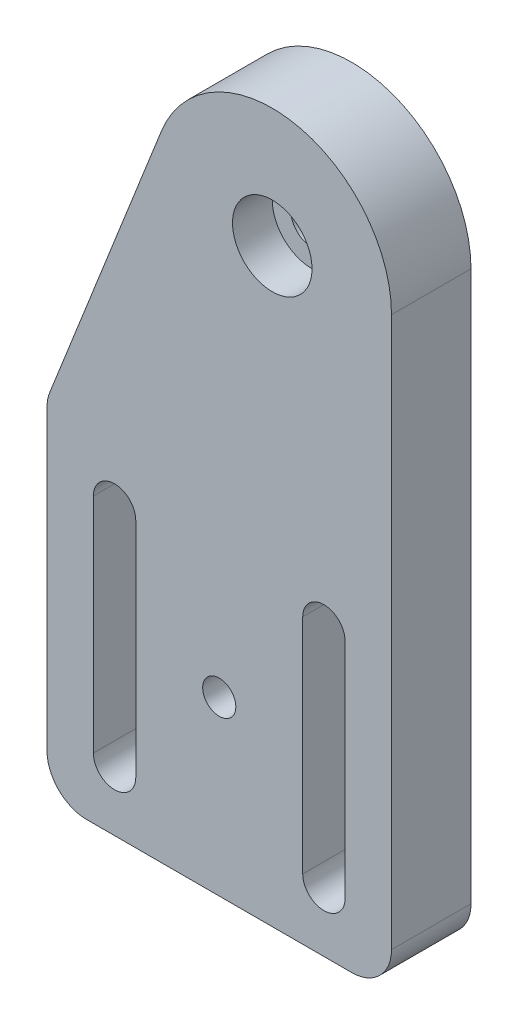
ISO-10303-21;
HEADER;
FILE_DESCRIPTION(('STEP AP214'),'2;1');
FILE_NAME('part.step','',(''),(''),'','','');
FILE_SCHEMA(('AUTOMOTIVE_DESIGN { 1 0 10303 214 1 1 1 1 }'));
ENDSEC;
DATA;
#1=APPLICATION_CONTEXT('core data for automotive mechanical design processes');
#2=APPLICATION_PROTOCOL_DEFINITION('international standard','automotive_design',2000,#1);
#3=PRODUCT_CONTEXT('',#1,'mechanical');
#4=PRODUCT('Part','Part','',(#3));
#5=PRODUCT_RELATED_PRODUCT_CATEGORY('part','',(#4));
#6=PRODUCT_DEFINITION_FORMATION('','',#4);
#7=PRODUCT_DEFINITION_CONTEXT('part definition',#1,'design');
#8=PRODUCT_DEFINITION('design','',#6,#7);
#9=PRODUCT_DEFINITION_SHAPE('','',#8);
#10=(LENGTH_UNIT() NAMED_UNIT(*) SI_UNIT(.MILLI.,.METRE.));
#11=(NAMED_UNIT(*) PLANE_ANGLE_UNIT() SI_UNIT($,.RADIAN.));
#12=(NAMED_UNIT(*) SI_UNIT($,.STERADIAN.) SOLID_ANGLE_UNIT());
#13=UNCERTAINTY_MEASURE_WITH_UNIT(LENGTH_MEASURE(1.E-05),#10,'distance_accuracy_value','');
#14=(GEOMETRIC_REPRESENTATION_CONTEXT(3) GLOBAL_UNCERTAINTY_ASSIGNED_CONTEXT((#13)) GLOBAL_UNIT_ASSIGNED_CONTEXT((#10,
#11,#12)) REPRESENTATION_CONTEXT('',''));
#15=CARTESIAN_POINT('',(0.,0.,0.));
#16=DIRECTION('',(0.,0.,1.));
#17=DIRECTION('',(1.,0.,0.));
#18=AXIS2_PLACEMENT_3D('',#15,#16,#17);
#19=CARTESIAN_POINT('',(4.,0.,-6.));
#20=DIRECTION('',(0.,0.,1.));
#21=DIRECTION('',(-1.,0.,0.));
#22=AXIS2_PLACEMENT_3D('',#19,#20,#21);
#23=PLANE('',#22);
#24=CARTESIAN_POINT('',(4.,0.,-6.));
#25=DIRECTION('',(0.,0.,1.));
#26=DIRECTION('',(1.,0.,0.));
#27=AXIS2_PLACEMENT_3D('',#24,#25,#26);
#28=CIRCLE('',#27,1.6);
#29=CARTESIAN_POINT('',(5.6,0.,-6.));
#30=VERTEX_POINT('',#29);
#31=EDGE_CURVE('E410',#30,#30,#28,.T.);
#32=ORIENTED_EDGE('',*,*,#31,.T.);
#33=EDGE_LOOP('',(#32));
#34=FACE_BOUND('',#33,.T.);
#35=CARTESIAN_POINT('',(0.,-31.5,-6.));
#36=DIRECTION('',(0.,0.,1.));
#37=DIRECTION('',(1.,0.,0.));
#38=AXIS2_PLACEMENT_3D('',#35,#36,#37);
#39=CIRCLE('',#38,1.25);
#40=CARTESIAN_POINT('',(1.25,-31.5,-6.));
#41=VERTEX_POINT('',#40);
#42=EDGE_CURVE('E405',#41,#41,#39,.T.);
#43=ORIENTED_EDGE('',*,*,#42,.T.);
#44=EDGE_LOOP('',(#43));
#45=FACE_BOUND('',#44,.T.);
#46=CARTESIAN_POINT('',(-7.9,-23.1,-6.));
#47=DIRECTION('',(0.,0.,1.));
#48=DIRECTION('',(1.,0.,0.));
#49=AXIS2_PLACEMENT_3D('',#46,#47,#48);
#50=CIRCLE('',#49,1.6);
#51=CARTESIAN_POINT('',(-6.3,-23.1,-6.));
#52=VERTEX_POINT('',#51);
#53=CARTESIAN_POINT('',(-9.5,-23.1,-6.));
#54=VERTEX_POINT('',#53);
#55=EDGE_CURVE('E195',#52,#54,#50,.T.);
#56=ORIENTED_EDGE('',*,*,#55,.T.);
#57=DIRECTION('',(0.,-1.,0.));
#58=VECTOR('',#57,1.);
#59=CARTESIAN_POINT('',(-9.5,-23.1,-6.));
#60=LINE('',#59,#58);
#61=CARTESIAN_POINT('',(-9.5,-39.9,-6.));
#62=VERTEX_POINT('',#61);
#63=EDGE_CURVE('E198',#54,#62,#60,.T.);
#64=ORIENTED_EDGE('',*,*,#63,.T.);
#65=CARTESIAN_POINT('',(-7.9,-39.9,-6.));
#66=DIRECTION('',(0.,0.,1.));
#67=DIRECTION('',(1.,0.,0.));
#68=AXIS2_PLACEMENT_3D('',#65,#66,#67);
#69=CIRCLE('',#68,1.6);
#70=CARTESIAN_POINT('',(-6.3,-39.9,-6.));
#71=VERTEX_POINT('',#70);
#72=EDGE_CURVE('E202',#62,#71,#69,.T.);
#73=ORIENTED_EDGE('',*,*,#72,.T.);
#74=DIRECTION('',(0.,-1.,0.));
#75=VECTOR('',#74,1.);
#76=CARTESIAN_POINT('',(-6.3,-23.1,-6.));
#77=LINE('',#76,#75);
#78=EDGE_CURVE('E205',#52,#71,#77,.T.);
#79=ORIENTED_EDGE('',*,*,#78,.F.);
#80=EDGE_LOOP('',(#56,#64,#73,#79));
#81=FACE_BOUND('',#80,.T.);
#82=DIRECTION('',(-1.,0.,0.));
#83=VECTOR('',#82,1.);
#84=CARTESIAN_POINT('',(13.,-44.5,-6.));
#85=LINE('',#84,#83);
#86=CARTESIAN_POINT('',(10.,-44.5,-6.));
#87=VERTEX_POINT('',#86);
#88=CARTESIAN_POINT('',(-9.99999999999999,-44.5,-6.));
#89=VERTEX_POINT('',#88);
#90=EDGE_CURVE('E230',#87,#89,#85,.T.);
#91=ORIENTED_EDGE('',*,*,#90,.T.);
#92=CARTESIAN_POINT('',(-10.,-41.5,-6.));
#93=DIRECTION('',(0.,0.,-1.));
#94=DIRECTION('',(-1.,0.,0.));
#95=AXIS2_PLACEMENT_3D('',#92,#93,#94);
#96=CIRCLE('',#95,3.);
#97=CARTESIAN_POINT('',(-13.,-41.5,-6.));
#98=VERTEX_POINT('',#97);
#99=EDGE_CURVE('E275',#98,#89,#96,.F.);
#100=ORIENTED_EDGE('',*,*,#99,.F.);
#101=DIRECTION('',(0.,1.,0.));
#102=VECTOR('',#101,1.);
#103=CARTESIAN_POINT('',(-13.,-44.5,-6.));
#104=LINE('',#103,#102);
#105=CARTESIAN_POINT('',(-13.,-19.0720086397861,-6.));
#106=VERTEX_POINT('',#105);
#107=EDGE_CURVE('E234',#98,#106,#104,.T.);
#108=ORIENTED_EDGE('',*,*,#107,.T.);
#109=CARTESIAN_POINT('',(-10.,-19.0720086397861,-6.));
#110=DIRECTION('',(0.,0.,-1.));
#111=DIRECTION('',(-1.,0.,0.));
#112=AXIS2_PLACEMENT_3D('',#109,#110,#111);
#113=CIRCLE('',#112,3.);
#114=CARTESIAN_POINT('',(-12.7895226229499,-17.9681229862646,-6.));
#115=VERTEX_POINT('',#114);
#116=EDGE_CURVE('E273',#115,#106,#113,.F.);
#117=ORIENTED_EDGE('',*,*,#116,.F.);
#118=DIRECTION('',(0.367961884507179,0.929840874316636,0.));
#119=VECTOR('',#118,1.);
#120=CARTESIAN_POINT('',(-13.,-18.5,-6.));
#121=LINE('',#120,#119);
#122=CARTESIAN_POINT('',(-4.36856786884972,3.31165696056461,-6.));
#123=VERTEX_POINT('',#122);
#124=EDGE_CURVE('E237',#115,#123,#121,.T.);
#125=ORIENTED_EDGE('',*,*,#124,.T.);
#126=CARTESIAN_POINT('',(4.,0.,-6.));
#127=DIRECTION('',(0.,0.,-1.));
#128=DIRECTION('',(-1.,0.,0.));
#129=AXIS2_PLACEMENT_3D('',#126,#127,#128);
#130=CIRCLE('',#129,9.);
#131=CARTESIAN_POINT('',(13.,0.,-6.));
#132=VERTEX_POINT('',#131);
#133=EDGE_CURVE('E240',#123,#132,#130,.T.);
#134=ORIENTED_EDGE('',*,*,#133,.T.);
#135=DIRECTION('',(0.,-1.,0.));
#136=VECTOR('',#135,1.);
#137=CARTESIAN_POINT('',(13.,-18.5,-6.));
#138=LINE('',#137,#136);
#139=CARTESIAN_POINT('',(13.,-41.5,-6.));
#140=VERTEX_POINT('',#139);
#141=EDGE_CURVE('E227',#132,#140,#138,.T.);
#142=ORIENTED_EDGE('',*,*,#141,.T.);
#143=CARTESIAN_POINT('',(10.,-41.5,-6.));
#144=DIRECTION('',(0.,0.,-1.));
#145=DIRECTION('',(-1.,0.,0.));
#146=AXIS2_PLACEMENT_3D('',#143,#144,#145);
#147=CIRCLE('',#146,3.);
#148=EDGE_CURVE('E277',#87,#140,#147,.F.);
#149=ORIENTED_EDGE('',*,*,#148,.F.);
#150=EDGE_LOOP('',(#91,#100,#108,#117,#125,#134,#142,#149));
#151=FACE_BOUND('',#150,.T.);
#152=CARTESIAN_POINT('',(7.9,-23.1,-6.));
#153=DIRECTION('',(0.,0.,1.));
#154=DIRECTION('',(1.,0.,0.));
#155=AXIS2_PLACEMENT_3D('',#152,#153,#154);
#156=CIRCLE('',#155,1.6);
#157=CARTESIAN_POINT('',(9.5,-23.1,-6.));
#158=VERTEX_POINT('',#157);
#159=CARTESIAN_POINT('',(6.3,-23.1,-6.));
#160=VERTEX_POINT('',#159);
#161=EDGE_CURVE('E153',#158,#160,#156,.T.);
#162=ORIENTED_EDGE('',*,*,#161,.T.);
#163=DIRECTION('',(0.,-1.,0.));
#164=VECTOR('',#163,1.);
#165=CARTESIAN_POINT('',(6.3,-23.1,-6.));
#166=LINE('',#165,#164);
#167=CARTESIAN_POINT('',(6.3,-39.9,-6.));
#168=VERTEX_POINT('',#167);
#169=EDGE_CURVE('E163',#160,#168,#166,.T.);
#170=ORIENTED_EDGE('',*,*,#169,.T.);
#171=CARTESIAN_POINT('',(7.9,-39.9,-6.));
#172=DIRECTION('',(0.,0.,1.));
#173=DIRECTION('',(1.,0.,0.));
#174=AXIS2_PLACEMENT_3D('',#171,#172,#173);
#175=CIRCLE('',#174,1.6);
#176=CARTESIAN_POINT('',(9.5,-39.9,-6.));
#177=VERTEX_POINT('',#176);
#178=EDGE_CURVE('E168',#168,#177,#175,.T.);
#179=ORIENTED_EDGE('',*,*,#178,.T.);
#180=DIRECTION('',(0.,-1.,0.));
#181=VECTOR('',#180,1.);
#182=CARTESIAN_POINT('',(9.5,-23.1,-6.));
#183=LINE('',#182,#181);
#184=EDGE_CURVE('E172',#158,#177,#183,.T.);
#185=ORIENTED_EDGE('',*,*,#184,.F.);
#186=EDGE_LOOP('',(#162,#170,#179,#185));
#187=FACE_BOUND('',#186,.T.);
#188=ADVANCED_FACE('F37',(#34,#45,#81,#151,#187),#23,.F.);
#189=CARTESIAN_POINT('',(4.,0.,0.));
#190=DIRECTION('',(0.,0.,1.));
#191=DIRECTION('',(-1.,0.,0.));
#192=AXIS2_PLACEMENT_3D('',#189,#190,#191);
#193=PLANE('',#192);
#194=CARTESIAN_POINT('',(0.,-31.5,0.));
#195=DIRECTION('',(0.,0.,1.));
#196=DIRECTION('',(1.,0.,0.));
#197=AXIS2_PLACEMENT_3D('',#194,#195,#196);
#198=CIRCLE('',#197,1.25);
#199=CARTESIAN_POINT('',(1.25,-31.5,0.));
#200=VERTEX_POINT('',#199);
#201=EDGE_CURVE('E402',#200,#200,#198,.T.);
#202=ORIENTED_EDGE('',*,*,#201,.F.);
#203=EDGE_LOOP('',(#202));
#204=FACE_BOUND('',#203,.T.);
#205=CARTESIAN_POINT('',(4.,0.,0.));
#206=DIRECTION('',(0.,0.,1.));
#207=DIRECTION('',(1.,0.,0.));
#208=AXIS2_PLACEMENT_3D('',#205,#206,#207);
#209=CIRCLE('',#208,3.);
#210=CARTESIAN_POINT('',(7.,0.,0.));
#211=VERTEX_POINT('',#210);
#212=EDGE_CURVE('E179',#211,#211,#209,.T.);
#213=ORIENTED_EDGE('',*,*,#212,.F.);
#214=EDGE_LOOP('',(#213));
#215=FACE_BOUND('',#214,.T.);
#216=DIRECTION('',(0.,1.,0.));
#217=VECTOR('',#216,1.);
#218=CARTESIAN_POINT('',(13.,-18.5,0.));
#219=LINE('',#218,#217);
#220=CARTESIAN_POINT('',(13.,-41.5,0.));
#221=VERTEX_POINT('',#220);
#222=CARTESIAN_POINT('',(13.,0.,0.));
#223=VERTEX_POINT('',#222);
#224=EDGE_CURVE('E231',#221,#223,#219,.T.);
#225=ORIENTED_EDGE('',*,*,#224,.T.);
#226=CARTESIAN_POINT('',(4.,0.,0.));
#227=DIRECTION('',(0.,0.,-1.));
#228=DIRECTION('',(-1.,0.,0.));
#229=AXIS2_PLACEMENT_3D('',#226,#227,#228);
#230=CIRCLE('',#229,9.);
#231=CARTESIAN_POINT('',(-4.36856786884972,3.31165696056461,0.));
#232=VERTEX_POINT('',#231);
#233=EDGE_CURVE('E251',#232,#223,#230,.T.);
#234=ORIENTED_EDGE('',*,*,#233,.F.);
#235=DIRECTION('',(0.367961884507179,0.929840874316636,0.));
#236=VECTOR('',#235,1.);
#237=CARTESIAN_POINT('',(-13.,-18.5,0.));
#238=LINE('',#237,#236);
#239=CARTESIAN_POINT('',(-12.7895226229499,-17.9681229862646,0.));
#240=VERTEX_POINT('',#239);
#241=EDGE_CURVE('E248',#240,#232,#238,.T.);
#242=ORIENTED_EDGE('',*,*,#241,.F.);
#243=CARTESIAN_POINT('',(-10.,-19.0720086397861,0.));
#244=DIRECTION('',(0.,0.,-1.));
#245=DIRECTION('',(-1.,0.,0.));
#246=AXIS2_PLACEMENT_3D('',#243,#244,#245);
#247=CIRCLE('',#246,3.);
#248=CARTESIAN_POINT('',(-13.,-19.0720086397861,0.));
#249=VERTEX_POINT('',#248);
#250=EDGE_CURVE('E261',#249,#240,#247,.T.);
#251=ORIENTED_EDGE('',*,*,#250,.F.);
#252=DIRECTION('',(0.,1.,0.));
#253=VECTOR('',#252,1.);
#254=CARTESIAN_POINT('',(-13.,-44.5,0.));
#255=LINE('',#254,#253);
#256=CARTESIAN_POINT('',(-13.,-41.5,0.));
#257=VERTEX_POINT('',#256);
#258=EDGE_CURVE('E246',#257,#249,#255,.T.);
#259=ORIENTED_EDGE('',*,*,#258,.F.);
#260=CARTESIAN_POINT('',(-10.,-41.5,0.));
#261=DIRECTION('',(0.,0.,-1.));
#262=DIRECTION('',(-1.,0.,0.));
#263=AXIS2_PLACEMENT_3D('',#260,#261,#262);
#264=CIRCLE('',#263,3.);
#265=CARTESIAN_POINT('',(-9.99999999999999,-44.5,0.));
#266=VERTEX_POINT('',#265);
#267=EDGE_CURVE('E264',#266,#257,#264,.T.);
#268=ORIENTED_EDGE('',*,*,#267,.F.);
#269=DIRECTION('',(-1.,0.,0.));
#270=VECTOR('',#269,1.);
#271=CARTESIAN_POINT('',(13.,-44.5,0.));
#272=LINE('',#271,#270);
#273=CARTESIAN_POINT('',(10.,-44.5,0.));
#274=VERTEX_POINT('',#273);
#275=EDGE_CURVE('E226',#274,#266,#272,.T.);
#276=ORIENTED_EDGE('',*,*,#275,.F.);
#277=CARTESIAN_POINT('',(10.,-41.5,0.));
#278=DIRECTION('',(0.,0.,-1.));
#279=DIRECTION('',(-1.,0.,0.));
#280=AXIS2_PLACEMENT_3D('',#277,#278,#279);
#281=CIRCLE('',#280,3.);
#282=EDGE_CURVE('E266',#221,#274,#281,.T.);
#283=ORIENTED_EDGE('',*,*,#282,.F.);
#284=EDGE_LOOP('',(#225,#234,#242,#251,#259,#268,#276,#283));
#285=FACE_BOUND('',#284,.T.);
#286=DIRECTION('',(0.,-1.,0.));
#287=VECTOR('',#286,1.);
#288=CARTESIAN_POINT('',(-6.3,-23.1,0.));
#289=LINE('',#288,#287);
#290=CARTESIAN_POINT('',(-6.3,-23.1,0.));
#291=VERTEX_POINT('',#290);
#292=CARTESIAN_POINT('',(-6.3,-39.9,0.));
#293=VERTEX_POINT('',#292);
#294=EDGE_CURVE('E199',#291,#293,#289,.T.);
#295=ORIENTED_EDGE('',*,*,#294,.T.);
#296=CARTESIAN_POINT('',(-7.9,-39.9,0.));
#297=DIRECTION('',(0.,0.,1.));
#298=DIRECTION('',(1.,0.,0.));
#299=AXIS2_PLACEMENT_3D('',#296,#297,#298);
#300=CIRCLE('',#299,1.6);
#301=CARTESIAN_POINT('',(-9.5,-39.9,0.));
#302=VERTEX_POINT('',#301);
#303=EDGE_CURVE('E214',#302,#293,#300,.T.);
#304=ORIENTED_EDGE('',*,*,#303,.F.);
#305=DIRECTION('',(0.,-1.,0.));
#306=VECTOR('',#305,1.);
#307=CARTESIAN_POINT('',(-9.5,-23.1,0.));
#308=LINE('',#307,#306);
#309=CARTESIAN_POINT('',(-9.5,-23.1,0.));
#310=VERTEX_POINT('',#309);
#311=EDGE_CURVE('E211',#310,#302,#308,.T.);
#312=ORIENTED_EDGE('',*,*,#311,.F.);
#313=CARTESIAN_POINT('',(-7.9,-23.1,0.));
#314=DIRECTION('',(0.,0.,1.));
#315=DIRECTION('',(1.,0.,0.));
#316=AXIS2_PLACEMENT_3D('',#313,#314,#315);
#317=CIRCLE('',#316,1.6);
#318=EDGE_CURVE('E159',#291,#310,#317,.T.);
#319=ORIENTED_EDGE('',*,*,#318,.F.);
#320=EDGE_LOOP('',(#295,#304,#312,#319));
#321=FACE_BOUND('',#320,.T.);
#322=DIRECTION('',(0.,-1.,0.));
#323=VECTOR('',#322,1.);
#324=CARTESIAN_POINT('',(9.5,-23.1,0.));
#325=LINE('',#324,#323);
#326=CARTESIAN_POINT('',(9.5,-23.1,0.));
#327=VERTEX_POINT('',#326);
#328=CARTESIAN_POINT('',(9.5,-39.9,0.));
#329=VERTEX_POINT('',#328);
#330=EDGE_CURVE('E173',#327,#329,#325,.T.);
#331=ORIENTED_EDGE('',*,*,#330,.T.);
#332=CARTESIAN_POINT('',(7.9,-39.9,0.));
#333=DIRECTION('',(0.,0.,1.));
#334=DIRECTION('',(1.,0.,0.));
#335=AXIS2_PLACEMENT_3D('',#332,#333,#334);
#336=CIRCLE('',#335,1.6);
#337=CARTESIAN_POINT('',(6.3,-39.9,0.));
#338=VERTEX_POINT('',#337);
#339=EDGE_CURVE('E176',#338,#329,#336,.T.);
#340=ORIENTED_EDGE('',*,*,#339,.F.);
#341=DIRECTION('',(0.,-1.,0.));
#342=VECTOR('',#341,1.);
#343=CARTESIAN_POINT('',(6.3,-23.1,0.));
#344=LINE('',#343,#342);
#345=CARTESIAN_POINT('',(6.3,-23.1,0.));
#346=VERTEX_POINT('',#345);
#347=EDGE_CURVE('E186',#346,#338,#344,.T.);
#348=ORIENTED_EDGE('',*,*,#347,.F.);
#349=CARTESIAN_POINT('',(7.9,-23.1,0.));
#350=DIRECTION('',(0.,0.,1.));
#351=DIRECTION('',(1.,0.,0.));
#352=AXIS2_PLACEMENT_3D('',#349,#350,#351);
#353=CIRCLE('',#352,1.6);
#354=EDGE_CURVE('E155',#327,#346,#353,.T.);
#355=ORIENTED_EDGE('',*,*,#354,.F.);
#356=EDGE_LOOP('',(#331,#340,#348,#355));
#357=FACE_BOUND('',#356,.T.);
#358=ADVANCED_FACE('F288',(#204,#215,#285,#321,#357),#193,.T.);
#359=CARTESIAN_POINT('',(13.,-18.5,-6.));
#360=DIRECTION('',(-1.,0.,0.));
#361=DIRECTION('',(0.,-1.,0.));
#362=AXIS2_PLACEMENT_3D('',#359,#360,#361);
#363=PLANE('',#362);
#364=ORIENTED_EDGE('',*,*,#141,.F.);
#365=DIRECTION('',(0.,0.,1.));
#366=VECTOR('',#365,1.);
#367=CARTESIAN_POINT('',(13.,0.,-6.));
#368=LINE('',#367,#366);
#369=EDGE_CURVE('E256',#132,#223,#368,.T.);
#370=ORIENTED_EDGE('',*,*,#369,.T.);
#371=ORIENTED_EDGE('',*,*,#224,.F.);
#372=DIRECTION('',(0.,0.,1.));
#373=VECTOR('',#372,1.);
#374=CARTESIAN_POINT('',(13.,-41.5,0.));
#375=LINE('',#374,#373);
#376=EDGE_CURVE('E258',#140,#221,#375,.T.);
#377=ORIENTED_EDGE('',*,*,#376,.F.);
#378=EDGE_LOOP('',(#364,#370,#371,#377));
#379=FACE_BOUND('',#378,.T.);
#380=ADVANCED_FACE('F308',(#379),#363,.F.);
#381=CARTESIAN_POINT('',(4.,0.,-6.));
#382=DIRECTION('',(0.,0.,1.));
#383=DIRECTION('',(-1.,0.,0.));
#384=AXIS2_PLACEMENT_3D('',#381,#382,#383);
#385=CYLINDRICAL_SURFACE('',#384,9.);
#386=ORIENTED_EDGE('',*,*,#233,.T.);
#387=ORIENTED_EDGE('',*,*,#369,.F.);
#388=ORIENTED_EDGE('',*,*,#133,.F.);
#389=DIRECTION('',(0.,0.,1.));
#390=VECTOR('',#389,1.);
#391=CARTESIAN_POINT('',(-4.36856786884972,3.31165696056461,-6.));
#392=LINE('',#391,#390);
#393=EDGE_CURVE('E243',#123,#232,#392,.T.);
#394=ORIENTED_EDGE('',*,*,#393,.T.);
#395=EDGE_LOOP('',(#386,#387,#388,#394));
#396=FACE_BOUND('',#395,.T.);
#397=ADVANCED_FACE('F310',(#396),#385,.T.);
#398=CARTESIAN_POINT('',(-13.,-18.5,-6.));
#399=DIRECTION('',(-0.929840874316636,0.367961884507179,0.));
#400=DIRECTION('',(-0.367961884507179,-0.929840874316636,0.));
#401=AXIS2_PLACEMENT_3D('',#398,#399,#400);
#402=PLANE('',#401);
#403=ORIENTED_EDGE('',*,*,#241,.T.);
#404=ORIENTED_EDGE('',*,*,#393,.F.);
#405=ORIENTED_EDGE('',*,*,#124,.F.);
#406=DIRECTION('',(0.,0.,1.));
#407=VECTOR('',#406,1.);
#408=CARTESIAN_POINT('',(-12.7895226229499,-17.9681229862646,-6.));
#409=LINE('',#408,#407);
#410=EDGE_CURVE('E11',#240,#115,#409,.F.);
#411=ORIENTED_EDGE('',*,*,#410,.F.);
#412=EDGE_LOOP('',(#403,#404,#405,#411));
#413=FACE_BOUND('',#412,.T.);
#414=ADVANCED_FACE('F292',(#413),#402,.T.);
#415=CARTESIAN_POINT('',(-13.,-44.5,-6.));
#416=DIRECTION('',(-1.,0.,0.));
#417=DIRECTION('',(0.,-1.,0.));
#418=AXIS2_PLACEMENT_3D('',#415,#416,#417);
#419=PLANE('',#418);
#420=ORIENTED_EDGE('',*,*,#258,.T.);
#421=DIRECTION('',(0.,0.,1.));
#422=VECTOR('',#421,1.);
#423=CARTESIAN_POINT('',(-13.,-19.0720086397861,-6.));
#424=LINE('',#423,#422);
#425=EDGE_CURVE('E52',#106,#249,#424,.T.);
#426=ORIENTED_EDGE('',*,*,#425,.F.);
#427=ORIENTED_EDGE('',*,*,#107,.F.);
#428=DIRECTION('',(0.,0.,1.));
#429=VECTOR('',#428,1.);
#430=CARTESIAN_POINT('',(-13.,-41.5,-6.));
#431=LINE('',#430,#429);
#432=EDGE_CURVE('E45',#257,#98,#431,.F.);
#433=ORIENTED_EDGE('',*,*,#432,.F.);
#434=EDGE_LOOP('',(#420,#426,#427,#433));
#435=FACE_BOUND('',#434,.T.);
#436=ADVANCED_FACE('F285',(#435),#419,.T.);
#437=CARTESIAN_POINT('',(13.,-44.5,-6.));
#438=DIRECTION('',(0.,-1.,0.));
#439=DIRECTION('',(1.,0.,0.));
#440=AXIS2_PLACEMENT_3D('',#437,#438,#439);
#441=PLANE('',#440);
#442=ORIENTED_EDGE('',*,*,#275,.T.);
#443=DIRECTION('',(0.,0.,1.));
#444=VECTOR('',#443,1.);
#445=CARTESIAN_POINT('',(-10.,-44.5,-6.));
#446=LINE('',#445,#444);
#447=EDGE_CURVE('E269',#89,#266,#446,.T.);
#448=ORIENTED_EDGE('',*,*,#447,.F.);
#449=ORIENTED_EDGE('',*,*,#90,.F.);
#450=DIRECTION('',(0.,0.,1.));
#451=VECTOR('',#450,1.);
#452=CARTESIAN_POINT('',(10.,-44.5,-6.));
#453=LINE('',#452,#451);
#454=EDGE_CURVE('E271',#274,#87,#453,.F.);
#455=ORIENTED_EDGE('',*,*,#454,.F.);
#456=EDGE_LOOP('',(#442,#448,#449,#455));
#457=FACE_BOUND('',#456,.T.);
#458=ADVANCED_FACE('F302',(#457),#441,.T.);
#459=CARTESIAN_POINT('',(-7.9,-23.1,-6.));
#460=DIRECTION('',(0.,0.,1.));
#461=DIRECTION('',(-1.,0.,0.));
#462=AXIS2_PLACEMENT_3D('',#459,#460,#461);
#463=CYLINDRICAL_SURFACE('',#462,1.6);
#464=ORIENTED_EDGE('',*,*,#318,.T.);
#465=DIRECTION('',(0.,0.,1.));
#466=VECTOR('',#465,1.);
#467=CARTESIAN_POINT('',(-9.5,-23.1,-6.));
#468=LINE('',#467,#466);
#469=EDGE_CURVE('E224',#54,#310,#468,.T.);
#470=ORIENTED_EDGE('',*,*,#469,.F.);
#471=ORIENTED_EDGE('',*,*,#55,.F.);
#472=DIRECTION('',(0.,0.,1.));
#473=VECTOR('',#472,1.);
#474=CARTESIAN_POINT('',(-6.3,-23.1,-6.));
#475=LINE('',#474,#473);
#476=EDGE_CURVE('E208',#52,#291,#475,.T.);
#477=ORIENTED_EDGE('',*,*,#476,.T.);
#478=EDGE_LOOP('',(#464,#470,#471,#477));
#479=FACE_BOUND('',#478,.T.);
#480=ADVANCED_FACE('F334',(#479),#463,.F.);
#481=CARTESIAN_POINT('',(-9.5,-23.1,-6.));
#482=DIRECTION('',(1.,0.,0.));
#483=DIRECTION('',(0.,0.,1.));
#484=AXIS2_PLACEMENT_3D('',#481,#482,#483);
#485=PLANE('',#484);
#486=ORIENTED_EDGE('',*,*,#311,.T.);
#487=DIRECTION('',(0.,0.,1.));
#488=VECTOR('',#487,1.);
#489=CARTESIAN_POINT('',(-9.5,-39.9,-6.));
#490=LINE('',#489,#488);
#491=EDGE_CURVE('E222',#62,#302,#490,.T.);
#492=ORIENTED_EDGE('',*,*,#491,.F.);
#493=ORIENTED_EDGE('',*,*,#63,.F.);
#494=ORIENTED_EDGE('',*,*,#469,.T.);
#495=EDGE_LOOP('',(#486,#492,#493,#494));
#496=FACE_BOUND('',#495,.T.);
#497=ADVANCED_FACE('F348',(#496),#485,.T.);
#498=CARTESIAN_POINT('',(-7.9,-39.9,-6.));
#499=DIRECTION('',(0.,0.,1.));
#500=DIRECTION('',(-1.,0.,0.));
#501=AXIS2_PLACEMENT_3D('',#498,#499,#500);
#502=CYLINDRICAL_SURFACE('',#501,1.6);
#503=ORIENTED_EDGE('',*,*,#303,.T.);
#504=DIRECTION('',(0.,0.,1.));
#505=VECTOR('',#504,1.);
#506=CARTESIAN_POINT('',(-6.3,-39.9,-6.));
#507=LINE('',#506,#505);
#508=EDGE_CURVE('E220',#71,#293,#507,.T.);
#509=ORIENTED_EDGE('',*,*,#508,.F.);
#510=ORIENTED_EDGE('',*,*,#72,.F.);
#511=ORIENTED_EDGE('',*,*,#491,.T.);
#512=EDGE_LOOP('',(#503,#509,#510,#511));
#513=FACE_BOUND('',#512,.T.);
#514=ADVANCED_FACE('F353',(#513),#502,.F.);
#515=CARTESIAN_POINT('',(-6.3,-23.1,-6.));
#516=DIRECTION('',(1.,0.,0.));
#517=DIRECTION('',(0.,0.,1.));
#518=AXIS2_PLACEMENT_3D('',#515,#516,#517);
#519=PLANE('',#518);
#520=ORIENTED_EDGE('',*,*,#294,.F.);
#521=ORIENTED_EDGE('',*,*,#476,.F.);
#522=ORIENTED_EDGE('',*,*,#78,.T.);
#523=ORIENTED_EDGE('',*,*,#508,.T.);
#524=EDGE_LOOP('',(#520,#521,#522,#523));
#525=FACE_BOUND('',#524,.T.);
#526=ADVANCED_FACE('F366',(#525),#519,.F.);
#527=CARTESIAN_POINT('',(7.9,-23.1,-6.));
#528=DIRECTION('',(0.,0.,1.));
#529=DIRECTION('',(-1.,0.,0.));
#530=AXIS2_PLACEMENT_3D('',#527,#528,#529);
#531=CYLINDRICAL_SURFACE('',#530,1.6);
#532=ORIENTED_EDGE('',*,*,#354,.T.);
#533=DIRECTION('',(0.,0.,1.));
#534=VECTOR('',#533,1.);
#535=CARTESIAN_POINT('',(6.3,-23.1,-6.));
#536=LINE('',#535,#534);
#537=EDGE_CURVE('E149',#160,#346,#536,.T.);
#538=ORIENTED_EDGE('',*,*,#537,.F.);
#539=ORIENTED_EDGE('',*,*,#161,.F.);
#540=DIRECTION('',(0.,0.,1.));
#541=VECTOR('',#540,1.);
#542=CARTESIAN_POINT('',(9.5,-23.1,-6.));
#543=LINE('',#542,#541);
#544=EDGE_CURVE('E184',#158,#327,#543,.T.);
#545=ORIENTED_EDGE('',*,*,#544,.T.);
#546=EDGE_LOOP('',(#532,#538,#539,#545));
#547=FACE_BOUND('',#546,.T.);
#548=ADVANCED_FACE('F151',(#547),#531,.F.);
#549=CARTESIAN_POINT('',(6.3,-23.1,-6.));
#550=DIRECTION('',(1.,0.,0.));
#551=DIRECTION('',(0.,0.,1.));
#552=AXIS2_PLACEMENT_3D('',#549,#550,#551);
#553=PLANE('',#552);
#554=ORIENTED_EDGE('',*,*,#347,.T.);
#555=DIRECTION('',(0.,0.,1.));
#556=VECTOR('',#555,1.);
#557=CARTESIAN_POINT('',(6.3,-39.9,-6.));
#558=LINE('',#557,#556);
#559=EDGE_CURVE('E160',#168,#338,#558,.T.);
#560=ORIENTED_EDGE('',*,*,#559,.F.);
#561=ORIENTED_EDGE('',*,*,#169,.F.);
#562=ORIENTED_EDGE('',*,*,#537,.T.);
#563=EDGE_LOOP('',(#554,#560,#561,#562));
#564=FACE_BOUND('',#563,.T.);
#565=ADVANCED_FACE('F164',(#564),#553,.T.);
#566=CARTESIAN_POINT('',(7.9,-39.9,-6.));
#567=DIRECTION('',(0.,0.,1.));
#568=DIRECTION('',(-1.,0.,0.));
#569=AXIS2_PLACEMENT_3D('',#566,#567,#568);
#570=CYLINDRICAL_SURFACE('',#569,1.6);
#571=ORIENTED_EDGE('',*,*,#339,.T.);
#572=DIRECTION('',(0.,0.,1.));
#573=VECTOR('',#572,1.);
#574=CARTESIAN_POINT('',(9.5,-39.9,-6.));
#575=LINE('',#574,#573);
#576=EDGE_CURVE('E192',#177,#329,#575,.T.);
#577=ORIENTED_EDGE('',*,*,#576,.F.);
#578=ORIENTED_EDGE('',*,*,#178,.F.);
#579=ORIENTED_EDGE('',*,*,#559,.T.);
#580=EDGE_LOOP('',(#571,#577,#578,#579));
#581=FACE_BOUND('',#580,.T.);
#582=ADVANCED_FACE('F379',(#581),#570,.F.);
#583=CARTESIAN_POINT('',(9.5,-23.1,-6.));
#584=DIRECTION('',(1.,0.,0.));
#585=DIRECTION('',(0.,0.,1.));
#586=AXIS2_PLACEMENT_3D('',#583,#584,#585);
#587=PLANE('',#586);
#588=ORIENTED_EDGE('',*,*,#330,.F.);
#589=ORIENTED_EDGE('',*,*,#544,.F.);
#590=ORIENTED_EDGE('',*,*,#184,.T.);
#591=ORIENTED_EDGE('',*,*,#576,.T.);
#592=EDGE_LOOP('',(#588,#589,#590,#591));
#593=FACE_BOUND('',#592,.T.);
#594=ADVANCED_FACE('F382',(#593),#587,.F.);
#595=CARTESIAN_POINT('',(4.,0.,-3.));
#596=DIRECTION('',(0.,0.,1.));
#597=DIRECTION('',(-1.,0.,0.));
#598=AXIS2_PLACEMENT_3D('',#595,#596,#597);
#599=CYLINDRICAL_SURFACE('',#598,3.);
#600=CARTESIAN_POINT('',(4.,0.,-3.));
#601=DIRECTION('',(0.,0.,1.));
#602=DIRECTION('',(1.,0.,0.));
#603=AXIS2_PLACEMENT_3D('',#600,#601,#602);
#604=CIRCLE('',#603,3.);
#605=CARTESIAN_POINT('',(7.,0.,-3.));
#606=VERTEX_POINT('',#605);
#607=EDGE_CURVE('E187',#606,#606,#604,.T.);
#608=ORIENTED_EDGE('',*,*,#607,.F.);
#609=EDGE_LOOP('',(#608));
#610=FACE_BOUND('',#609,.T.);
#611=ORIENTED_EDGE('',*,*,#212,.T.);
#612=EDGE_LOOP('',(#611));
#613=FACE_BOUND('',#612,.T.);
#614=ADVANCED_FACE('F386',(#610,#613),#599,.F.);
#615=CARTESIAN_POINT('',(4.,0.,-3.));
#616=DIRECTION('',(0.,0.,-1.));
#617=DIRECTION('',(1.,0.,0.));
#618=AXIS2_PLACEMENT_3D('',#615,#616,#617);
#619=PLANE('',#618);
#620=CARTESIAN_POINT('',(4.,0.,-3.));
#621=DIRECTION('',(0.,0.,1.));
#622=DIRECTION('',(1.,0.,0.));
#623=AXIS2_PLACEMENT_3D('',#620,#621,#622);
#624=CIRCLE('',#623,1.6);
#625=CARTESIAN_POINT('',(5.6,0.,-3.));
#626=VERTEX_POINT('',#625);
#627=EDGE_CURVE('E406',#626,#626,#624,.T.);
#628=ORIENTED_EDGE('',*,*,#627,.F.);
#629=EDGE_LOOP('',(#628));
#630=FACE_BOUND('',#629,.T.);
#631=ORIENTED_EDGE('',*,*,#607,.T.);
#632=EDGE_LOOP('',(#631));
#633=FACE_BOUND('',#632,.T.);
#634=ADVANCED_FACE('F390',(#630,#633),#619,.F.);
#635=CARTESIAN_POINT('',(0.,-31.5,-6.));
#636=DIRECTION('',(0.,0.,-1.));
#637=DIRECTION('',(1.,0.,0.));
#638=AXIS2_PLACEMENT_3D('',#635,#636,#637);
#639=CYLINDRICAL_SURFACE('',#638,1.25);
#640=ORIENTED_EDGE('',*,*,#201,.T.);
#641=EDGE_LOOP('',(#640));
#642=FACE_BOUND('',#641,.T.);
#643=ORIENTED_EDGE('',*,*,#42,.F.);
#644=EDGE_LOOP('',(#643));
#645=FACE_BOUND('',#644,.T.);
#646=ADVANCED_FACE('F319',(#642,#645),#639,.F.);
#647=CARTESIAN_POINT('',(4.,0.,-6.));
#648=DIRECTION('',(0.,0.,-1.));
#649=DIRECTION('',(1.,0.,0.));
#650=AXIS2_PLACEMENT_3D('',#647,#648,#649);
#651=CYLINDRICAL_SURFACE('',#650,1.6);
#652=ORIENTED_EDGE('',*,*,#31,.F.);
#653=EDGE_LOOP('',(#652));
#654=FACE_BOUND('',#653,.T.);
#655=ORIENTED_EDGE('',*,*,#627,.T.);
#656=EDGE_LOOP('',(#655));
#657=FACE_BOUND('',#656,.T.);
#658=ADVANCED_FACE('F313',(#654,#657),#651,.F.);
#659=CARTESIAN_POINT('',(10.,-41.5,-6.));
#660=DIRECTION('',(0.,0.,-1.));
#661=DIRECTION('',(1.,0.,0.));
#662=AXIS2_PLACEMENT_3D('',#659,#660,#661);
#663=CYLINDRICAL_SURFACE('',#662,3.);
#664=ORIENTED_EDGE('',*,*,#148,.T.);
#665=ORIENTED_EDGE('',*,*,#376,.T.);
#666=ORIENTED_EDGE('',*,*,#282,.T.);
#667=ORIENTED_EDGE('',*,*,#454,.T.);
#668=EDGE_LOOP('',(#664,#665,#666,#667));
#669=FACE_BOUND('',#668,.T.);
#670=ADVANCED_FACE('F311',(#669),#663,.T.);
#671=CARTESIAN_POINT('',(-10.,-41.5,-6.));
#672=DIRECTION('',(0.,0.,1.));
#673=DIRECTION('',(-1.,0.,0.));
#674=AXIS2_PLACEMENT_3D('',#671,#672,#673);
#675=CYLINDRICAL_SURFACE('',#674,3.);
#676=ORIENTED_EDGE('',*,*,#99,.T.);
#677=ORIENTED_EDGE('',*,*,#447,.T.);
#678=ORIENTED_EDGE('',*,*,#267,.T.);
#679=ORIENTED_EDGE('',*,*,#432,.T.);
#680=EDGE_LOOP('',(#676,#677,#678,#679));
#681=FACE_BOUND('',#680,.T.);
#682=ADVANCED_FACE('F299',(#681),#675,.T.);
#683=CARTESIAN_POINT('',(-10.,-19.0720086397861,-6.));
#684=DIRECTION('',(0.,0.,1.));
#685=DIRECTION('',(-1.,0.,0.));
#686=AXIS2_PLACEMENT_3D('',#683,#684,#685);
#687=CYLINDRICAL_SURFACE('',#686,3.);
#688=ORIENTED_EDGE('',*,*,#116,.T.);
#689=ORIENTED_EDGE('',*,*,#425,.T.);
#690=ORIENTED_EDGE('',*,*,#250,.T.);
#691=ORIENTED_EDGE('',*,*,#410,.T.);
#692=EDGE_LOOP('',(#688,#689,#690,#691));
#693=FACE_BOUND('',#692,.T.);
#694=ADVANCED_FACE('F39',(#693),#687,.T.);
#695=CLOSED_SHELL('',(#188,#358,#380,#397,#414,#436,#458,#480,#497,#514,#526,#548,#565,#582,
#594,#614,#634,#646,#658,#670,#682,#694));
#696=MANIFOLD_SOLID_BREP('B2',#695);
#697=ADVANCED_BREP_SHAPE_REPRESENTATION('',(#18,#696),#14);
#698=SHAPE_DEFINITION_REPRESENTATION(#9,#697);
ENDSEC;
END-ISO-10303-21;
